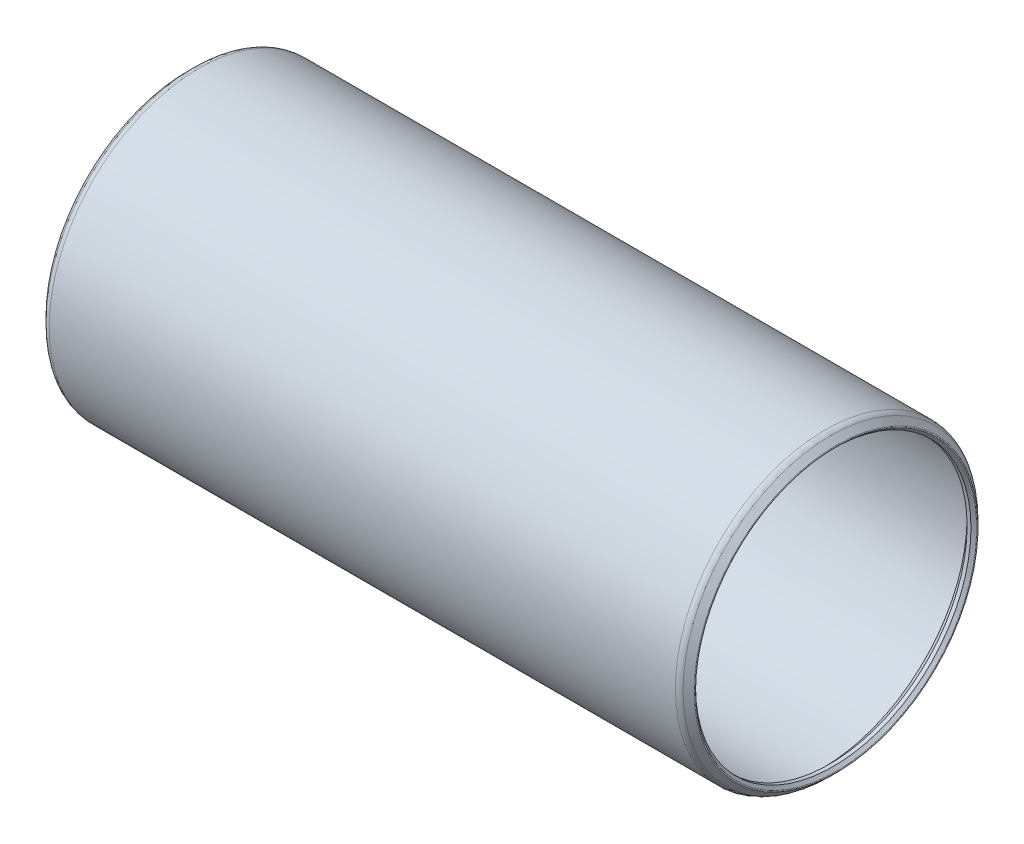
ISO-10303-21;
HEADER;
FILE_DESCRIPTION(('STEP AP214'),'2;1');
FILE_NAME('part.step','',(''),(''),'','','');
FILE_SCHEMA(('AUTOMOTIVE_DESIGN { 1 0 10303 214 1 1 1 1 }'));
ENDSEC;
DATA;
#1=APPLICATION_CONTEXT('core data for automotive mechanical design processes');
#2=APPLICATION_PROTOCOL_DEFINITION('international standard','automotive_design',2000,#1);
#3=PRODUCT_CONTEXT('',#1,'mechanical');
#4=PRODUCT('Part','Part','',(#3));
#5=PRODUCT_RELATED_PRODUCT_CATEGORY('part','',(#4));
#6=PRODUCT_DEFINITION_FORMATION('','',#4);
#7=PRODUCT_DEFINITION_CONTEXT('part definition',#1,'design');
#8=PRODUCT_DEFINITION('design','',#6,#7);
#9=PRODUCT_DEFINITION_SHAPE('','',#8);
#10=(LENGTH_UNIT() NAMED_UNIT(*) SI_UNIT(.MILLI.,.METRE.));
#11=(NAMED_UNIT(*) PLANE_ANGLE_UNIT() SI_UNIT($,.RADIAN.));
#12=(NAMED_UNIT(*) SI_UNIT($,.STERADIAN.) SOLID_ANGLE_UNIT());
#13=UNCERTAINTY_MEASURE_WITH_UNIT(LENGTH_MEASURE(1.E-05),#10,'distance_accuracy_value','');
#14=(GEOMETRIC_REPRESENTATION_CONTEXT(3) GLOBAL_UNCERTAINTY_ASSIGNED_CONTEXT((#13)) GLOBAL_UNIT_ASSIGNED_CONTEXT((#10,
#11,#12)) REPRESENTATION_CONTEXT('',''));
#15=CARTESIAN_POINT('',(0.,0.,0.));
#16=DIRECTION('',(0.,0.,1.));
#17=DIRECTION('',(1.,0.,0.));
#18=AXIS2_PLACEMENT_3D('',#15,#16,#17);
#19=CARTESIAN_POINT('',(-0.792815367264612,0.,0.));
#20=DIRECTION('',(-1.,0.,0.));
#21=DIRECTION('',(0.,0.,1.));
#22=AXIS2_PLACEMENT_3D('',#19,#20,#21);
#23=TOROIDAL_SURFACE('',#22,18.6444704896855,0.126999999999538);
#24=CARTESIAN_POINT('',(-0.882617928474841,0.,0.));
#25=DIRECTION('',(-1.,0.,0.));
#26=DIRECTION('',(0.,0.,1.));
#27=AXIS2_PLACEMENT_3D('',#24,#25,#26);
#28=CIRCLE('',#27,18.554667928475);
#29=CARTESIAN_POINT('',(-0.882617928474841,0.,18.554667928475));
#30=VERTEX_POINT('',#29);
#31=EDGE_CURVE('E10',#30,#30,#28,.T.);
#32=ORIENTED_EDGE('',*,*,#31,.F.);
#33=EDGE_LOOP('',(#32));
#34=FACE_BOUND('',#33,.T.);
#35=CARTESIAN_POINT('',(-0.882617928474841,0.,0.));
#36=DIRECTION('',(-1.,0.,0.));
#37=DIRECTION('',(0.,0.,1.));
#38=AXIS2_PLACEMENT_3D('',#35,#36,#37);
#39=CIRCLE('',#38,18.734273050896);
#40=CARTESIAN_POINT('',(-0.882617928474841,0.,18.734273050896));
#41=VERTEX_POINT('',#40);
#42=EDGE_CURVE('E80',#41,#41,#39,.T.);
#43=ORIENTED_EDGE('',*,*,#42,.T.);
#44=EDGE_LOOP('',(#43));
#45=FACE_BOUND('',#44,.T.);
#46=ADVANCED_FACE('F34',(#34,#45),#23,.T.);
#47=CARTESIAN_POINT('',(-0.882617928474841,0.,0.));
#48=DIRECTION('',(-1.,0.,0.));
#49=DIRECTION('',(0.,0.,1.));
#50=AXIS2_PLACEMENT_3D('',#47,#48,#49);
#51=CONICAL_SURFACE('',#50,18.554667928475,0.785398163397647);
#52=CARTESIAN_POINT('',(-0.507999999999995,0.,0.));
#53=DIRECTION('',(-1.,0.,0.));
#54=DIRECTION('',(0.,0.,1.));
#55=AXIS2_PLACEMENT_3D('',#52,#53,#54);
#56=CIRCLE('',#55,18.18005);
#57=CARTESIAN_POINT('',(-0.507999999999995,0.,18.18005));
#58=VERTEX_POINT('',#57);
#59=EDGE_CURVE('E40',#58,#58,#56,.T.);
#60=ORIENTED_EDGE('',*,*,#59,.F.);
#61=EDGE_LOOP('',(#60));
#62=FACE_BOUND('',#61,.T.);
#63=ORIENTED_EDGE('',*,*,#31,.T.);
#64=EDGE_LOOP('',(#63));
#65=FACE_BOUND('',#64,.T.);
#66=ADVANCED_FACE('F153',(#62,#65),#51,.F.);
#67=CARTESIAN_POINT('',(83.8073,0.,0.));
#68=DIRECTION('',(-1.,0.,0.));
#69=DIRECTION('',(0.,0.,1.));
#70=AXIS2_PLACEMENT_3D('',#67,#68,#69);
#71=CYLINDRICAL_SURFACE('',#70,18.18005);
#72=CARTESIAN_POINT('',(0.,0.,0.));
#73=DIRECTION('',(-1.,0.,0.));
#74=DIRECTION('',(0.,0.,1.));
#75=AXIS2_PLACEMENT_3D('',#72,#73,#74);
#76=CIRCLE('',#75,18.18005);
#77=CARTESIAN_POINT('',(0.,0.,18.18005));
#78=VERTEX_POINT('',#77);
#79=EDGE_CURVE('E44',#78,#78,#76,.T.);
#80=ORIENTED_EDGE('',*,*,#79,.F.);
#81=EDGE_LOOP('',(#80));
#82=FACE_BOUND('',#81,.T.);
#83=ORIENTED_EDGE('',*,*,#59,.T.);
#84=EDGE_LOOP('',(#83));
#85=FACE_BOUND('',#84,.T.);
#86=ADVANCED_FACE('F148',(#82,#85),#71,.F.);
#87=CARTESIAN_POINT('',(0.,0.,0.));
#88=DIRECTION('',(1.,0.,0.));
#89=DIRECTION('',(0.,0.,-1.));
#90=AXIS2_PLACEMENT_3D('',#87,#88,#89);
#91=CONICAL_SURFACE('',#90,18.18005,0.785398163397445);
#92=CARTESIAN_POINT('',(1.016,0.,0.));
#93=DIRECTION('',(-1.,0.,0.));
#94=DIRECTION('',(0.,0.,1.));
#95=AXIS2_PLACEMENT_3D('',#92,#93,#94);
#96=CIRCLE('',#95,19.19605);
#97=CARTESIAN_POINT('',(1.016,0.,19.19605));
#98=VERTEX_POINT('',#97);
#99=EDGE_CURVE('E48',#98,#98,#96,.T.);
#100=ORIENTED_EDGE('',*,*,#99,.F.);
#101=EDGE_LOOP('',(#100));
#102=FACE_BOUND('',#101,.T.);
#103=ORIENTED_EDGE('',*,*,#79,.T.);
#104=EDGE_LOOP('',(#103));
#105=FACE_BOUND('',#104,.T.);
#106=ADVANCED_FACE('F142',(#102,#105),#91,.F.);
#107=CARTESIAN_POINT('',(83.8073,0.,0.));
#108=DIRECTION('',(-1.,0.,0.));
#109=DIRECTION('',(0.,0.,1.));
#110=AXIS2_PLACEMENT_3D('',#107,#108,#109);
#111=CYLINDRICAL_SURFACE('',#110,19.19605);
#112=CARTESIAN_POINT('',(82.7913,0.,0.));
#113=DIRECTION('',(-1.,0.,0.));
#114=DIRECTION('',(0.,0.,1.));
#115=AXIS2_PLACEMENT_3D('',#112,#113,#114);
#116=CIRCLE('',#115,19.19605);
#117=CARTESIAN_POINT('',(82.7913,0.,19.19605));
#118=VERTEX_POINT('',#117);
#119=EDGE_CURVE('E53',#118,#118,#116,.T.);
#120=ORIENTED_EDGE('',*,*,#119,.F.);
#121=EDGE_LOOP('',(#120));
#122=FACE_BOUND('',#121,.T.);
#123=ORIENTED_EDGE('',*,*,#99,.T.);
#124=EDGE_LOOP('',(#123));
#125=FACE_BOUND('',#124,.T.);
#126=ADVANCED_FACE('F136',(#122,#125),#111,.F.);
#127=CARTESIAN_POINT('',(82.7913,0.,0.));
#128=DIRECTION('',(-1.,0.,0.));
#129=DIRECTION('',(0.,0.,1.));
#130=AXIS2_PLACEMENT_3D('',#127,#128,#129);
#131=CONICAL_SURFACE('',#130,19.19605,0.785398163397452);
#132=CARTESIAN_POINT('',(83.8073,0.,0.));
#133=DIRECTION('',(-1.,0.,0.));
#134=DIRECTION('',(0.,0.,1.));
#135=AXIS2_PLACEMENT_3D('',#132,#133,#134);
#136=CIRCLE('',#135,18.18005);
#137=CARTESIAN_POINT('',(83.8073,0.,18.18005));
#138=VERTEX_POINT('',#137);
#139=EDGE_CURVE('E56',#138,#138,#136,.T.);
#140=ORIENTED_EDGE('',*,*,#139,.F.);
#141=EDGE_LOOP('',(#140));
#142=FACE_BOUND('',#141,.T.);
#143=ORIENTED_EDGE('',*,*,#119,.T.);
#144=EDGE_LOOP('',(#143));
#145=FACE_BOUND('',#144,.T.);
#146=ADVANCED_FACE('F130',(#142,#145),#131,.F.);
#147=CARTESIAN_POINT('',(83.8073,0.,0.));
#148=DIRECTION('',(-1.,0.,0.));
#149=DIRECTION('',(0.,0.,1.));
#150=AXIS2_PLACEMENT_3D('',#147,#148,#149);
#151=CYLINDRICAL_SURFACE('',#150,18.18005);
#152=CARTESIAN_POINT('',(84.3153,0.,0.));
#153=DIRECTION('',(-1.,0.,0.));
#154=DIRECTION('',(0.,0.,1.));
#155=AXIS2_PLACEMENT_3D('',#152,#153,#154);
#156=CIRCLE('',#155,18.18005);
#157=CARTESIAN_POINT('',(84.3153,0.,18.18005));
#158=VERTEX_POINT('',#157);
#159=EDGE_CURVE('E59',#158,#158,#156,.T.);
#160=ORIENTED_EDGE('',*,*,#159,.F.);
#161=EDGE_LOOP('',(#160));
#162=FACE_BOUND('',#161,.T.);
#163=ORIENTED_EDGE('',*,*,#139,.T.);
#164=EDGE_LOOP('',(#163));
#165=FACE_BOUND('',#164,.T.);
#166=ADVANCED_FACE('F124',(#162,#165),#151,.F.);
#167=CARTESIAN_POINT('',(84.3153,0.,0.));
#168=DIRECTION('',(1.,0.,0.));
#169=DIRECTION('',(0.,0.,-1.));
#170=AXIS2_PLACEMENT_3D('',#167,#168,#169);
#171=CONICAL_SURFACE('',#170,18.18005,0.785398163397444);
#172=CARTESIAN_POINT('',(84.689917928475,0.,0.));
#173=DIRECTION('',(-1.,0.,0.));
#174=DIRECTION('',(0.,0.,1.));
#175=AXIS2_PLACEMENT_3D('',#172,#173,#174);
#176=CIRCLE('',#175,18.554667928475);
#177=CARTESIAN_POINT('',(84.689917928475,0.,18.554667928475));
#178=VERTEX_POINT('',#177);
#179=EDGE_CURVE('E62',#178,#178,#176,.T.);
#180=ORIENTED_EDGE('',*,*,#179,.F.);
#181=EDGE_LOOP('',(#180));
#182=FACE_BOUND('',#181,.T.);
#183=ORIENTED_EDGE('',*,*,#159,.T.);
#184=EDGE_LOOP('',(#183));
#185=FACE_BOUND('',#184,.T.);
#186=ADVANCED_FACE('F118',(#182,#185),#171,.F.);
#187=CARTESIAN_POINT('',(84.6001153672637,0.,0.));
#188=DIRECTION('',(-1.,0.,0.));
#189=DIRECTION('',(0.,0.,1.));
#190=AXIS2_PLACEMENT_3D('',#187,#188,#189);
#191=TOROIDAL_SURFACE('',#190,18.6444704896855,0.127000000000276);
#192=CARTESIAN_POINT('',(84.689917928475,0.,0.));
#193=DIRECTION('',(-1.,0.,0.));
#194=DIRECTION('',(0.,0.,1.));
#195=AXIS2_PLACEMENT_3D('',#192,#193,#194);
#196=CIRCLE('',#195,18.734273050896);
#197=CARTESIAN_POINT('',(84.689917928475,0.,18.734273050896));
#198=VERTEX_POINT('',#197);
#199=EDGE_CURVE('E65',#198,#198,#196,.T.);
#200=ORIENTED_EDGE('',*,*,#199,.F.);
#201=EDGE_LOOP('',(#200));
#202=FACE_BOUND('',#201,.T.);
#203=ORIENTED_EDGE('',*,*,#179,.T.);
#204=EDGE_LOOP('',(#203));
#205=FACE_BOUND('',#204,.T.);
#206=ADVANCED_FACE('F112',(#202,#205),#191,.T.);
#207=CARTESIAN_POINT('',(84.689917928475,0.,0.));
#208=DIRECTION('',(-1.,0.,0.));
#209=DIRECTION('',(0.,0.,1.));
#210=AXIS2_PLACEMENT_3D('',#207,#208,#209);
#211=CONICAL_SURFACE('',#210,18.734273050896,0.785398163397859);
#212=CARTESIAN_POINT('',(83.9542204896891,0.,0.));
#213=DIRECTION('',(-1.,0.,0.));
#214=DIRECTION('',(0.,0.,1.));
#215=AXIS2_PLACEMENT_3D('',#212,#213,#214);
#216=CIRCLE('',#215,19.4699704896825);
#217=CARTESIAN_POINT('',(83.9542204896891,0.,19.4699704896825));
#218=VERTEX_POINT('',#217);
#219=EDGE_CURVE('E68',#218,#218,#216,.T.);
#220=ORIENTED_EDGE('',*,*,#219,.F.);
#221=EDGE_LOOP('',(#220));
#222=FACE_BOUND('',#221,.T.);
#223=ORIENTED_EDGE('',*,*,#199,.T.);
#224=EDGE_LOOP('',(#223));
#225=FACE_BOUND('',#224,.T.);
#226=ADVANCED_FACE('F106',(#222,#225),#211,.T.);
#227=CARTESIAN_POINT('',(83.2357999999971,0.,0.));
#228=DIRECTION('',(-1.,0.,0.));
#229=DIRECTION('',(0.,0.,1.));
#230=AXIS2_PLACEMENT_3D('',#227,#228,#229);
#231=TOROIDAL_SURFACE('',#230,18.7515499999907,1.016000000009);
#232=CARTESIAN_POINT('',(83.2357999999971,0.,0.));
#233=DIRECTION('',(-1.,0.,0.));
#234=DIRECTION('',(0.,0.,1.));
#235=AXIS2_PLACEMENT_3D('',#232,#233,#234);
#236=CIRCLE('',#235,19.7675499999997);
#237=CARTESIAN_POINT('',(83.2357999999971,0.,19.7675499999997));
#238=VERTEX_POINT('',#237);
#239=EDGE_CURVE('E71',#238,#238,#236,.T.);
#240=ORIENTED_EDGE('',*,*,#239,.F.);
#241=EDGE_LOOP('',(#240));
#242=FACE_BOUND('',#241,.T.);
#243=ORIENTED_EDGE('',*,*,#219,.T.);
#244=EDGE_LOOP('',(#243));
#245=FACE_BOUND('',#244,.T.);
#246=ADVANCED_FACE('F100',(#242,#245),#231,.T.);
#247=CARTESIAN_POINT('',(83.8073,0.,0.));
#248=DIRECTION('',(-1.,0.,0.));
#249=DIRECTION('',(0.,0.,1.));
#250=AXIS2_PLACEMENT_3D('',#247,#248,#249);
#251=CYLINDRICAL_SURFACE('',#250,19.7675499999996);
#252=CARTESIAN_POINT('',(0.571500000002959,0.,0.));
#253=DIRECTION('',(-1.,0.,0.));
#254=DIRECTION('',(0.,0.,1.));
#255=AXIS2_PLACEMENT_3D('',#252,#253,#254);
#256=CIRCLE('',#255,19.7675499999996);
#257=CARTESIAN_POINT('',(0.571500000002959,0.,19.7675499999996));
#258=VERTEX_POINT('',#257);
#259=EDGE_CURVE('E74',#258,#258,#256,.T.);
#260=ORIENTED_EDGE('',*,*,#259,.F.);
#261=EDGE_LOOP('',(#260));
#262=FACE_BOUND('',#261,.T.);
#263=ORIENTED_EDGE('',*,*,#239,.T.);
#264=EDGE_LOOP('',(#263));
#265=FACE_BOUND('',#264,.T.);
#266=ADVANCED_FACE('F94',(#262,#265),#251,.T.);
#267=CARTESIAN_POINT('',(0.57150000000261,0.,0.));
#268=DIRECTION('',(-1.,0.,0.));
#269=DIRECTION('',(0.,0.,1.));
#270=AXIS2_PLACEMENT_3D('',#267,#268,#269);
#271=TOROIDAL_SURFACE('',#270,18.7515499999926,1.01600000000701);
#272=CARTESIAN_POINT('',(-0.146920489687827,0.,0.));
#273=DIRECTION('',(-1.,0.,0.));
#274=DIRECTION('',(0.,0.,1.));
#275=AXIS2_PLACEMENT_3D('',#272,#273,#274);
#276=CIRCLE('',#275,19.469970489683);
#277=CARTESIAN_POINT('',(-0.146920489687827,0.,19.469970489683));
#278=VERTEX_POINT('',#277);
#279=EDGE_CURVE('E77',#278,#278,#276,.T.);
#280=ORIENTED_EDGE('',*,*,#279,.F.);
#281=EDGE_LOOP('',(#280));
#282=FACE_BOUND('',#281,.T.);
#283=ORIENTED_EDGE('',*,*,#259,.T.);
#284=EDGE_LOOP('',(#283));
#285=FACE_BOUND('',#284,.T.);
#286=ADVANCED_FACE('F88',(#282,#285),#271,.T.);
#287=CARTESIAN_POINT('',(-0.146920489687827,0.,0.));
#288=DIRECTION('',(1.,0.,0.));
#289=DIRECTION('',(0.,0.,-1.));
#290=AXIS2_PLACEMENT_3D('',#287,#288,#289);
#291=CONICAL_SURFACE('',#290,19.469970489683,0.785398163397451);
#292=ORIENTED_EDGE('',*,*,#42,.F.);
#293=EDGE_LOOP('',(#292));
#294=FACE_BOUND('',#293,.T.);
#295=ORIENTED_EDGE('',*,*,#279,.T.);
#296=EDGE_LOOP('',(#295));
#297=FACE_BOUND('',#296,.T.);
#298=ADVANCED_FACE('F85',(#294,#297),#291,.T.);
#299=CLOSED_SHELL('',(#46,#66,#86,#106,#126,#146,#166,#186,#206,#226,#246,#266,#286,#298));
#300=MANIFOLD_SOLID_BREP('B2',#299);
#301=ADVANCED_BREP_SHAPE_REPRESENTATION('',(#18,#300),#14);
#302=SHAPE_DEFINITION_REPRESENTATION(#9,#301);
ENDSEC;
END-ISO-10303-21;
